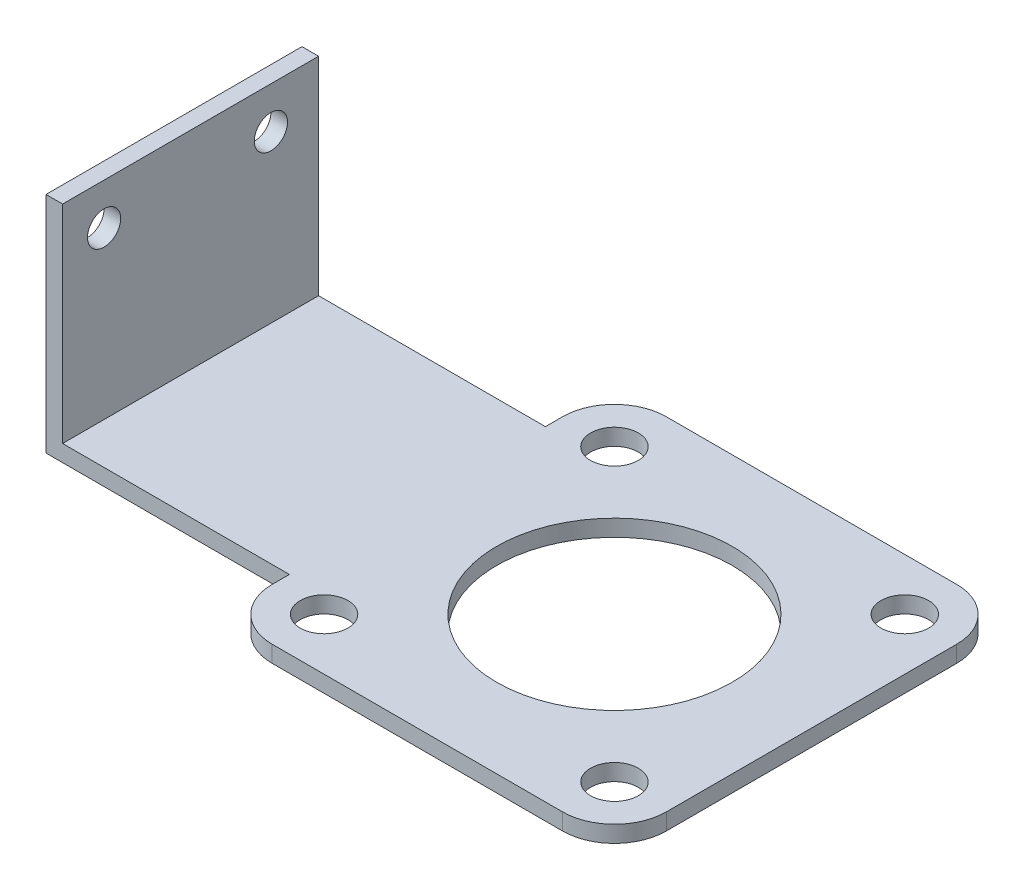
ISO-10303-21;
HEADER;
FILE_DESCRIPTION(('STEP AP214'),'2;1');
FILE_NAME('part.step','',(''),(''),'','','');
FILE_SCHEMA(('AUTOMOTIVE_DESIGN { 1 0 10303 214 1 1 1 1 }'));
ENDSEC;
DATA;
#1=APPLICATION_CONTEXT('core data for automotive mechanical design processes');
#2=APPLICATION_PROTOCOL_DEFINITION('international standard','automotive_design',2000,#1);
#3=PRODUCT_CONTEXT('',#1,'mechanical');
#4=PRODUCT('Part','Part','',(#3));
#5=PRODUCT_RELATED_PRODUCT_CATEGORY('part','',(#4));
#6=PRODUCT_DEFINITION_FORMATION('','',#4);
#7=PRODUCT_DEFINITION_CONTEXT('part definition',#1,'design');
#8=PRODUCT_DEFINITION('design','',#6,#7);
#9=PRODUCT_DEFINITION_SHAPE('','',#8);
#10=(LENGTH_UNIT() NAMED_UNIT(*) SI_UNIT(.MILLI.,.METRE.));
#11=(NAMED_UNIT(*) PLANE_ANGLE_UNIT() SI_UNIT($,.RADIAN.));
#12=(NAMED_UNIT(*) SI_UNIT($,.STERADIAN.) SOLID_ANGLE_UNIT());
#13=UNCERTAINTY_MEASURE_WITH_UNIT(LENGTH_MEASURE(1.E-05),#10,'distance_accuracy_value','');
#14=(GEOMETRIC_REPRESENTATION_CONTEXT(3) GLOBAL_UNCERTAINTY_ASSIGNED_CONTEXT((#13)) GLOBAL_UNIT_ASSIGNED_CONTEXT((#10,
#11,#12)) REPRESENTATION_CONTEXT('',''));
#15=CARTESIAN_POINT('',(0.,0.,0.));
#16=DIRECTION('',(0.,0.,1.));
#17=DIRECTION('',(1.,0.,0.));
#18=AXIS2_PLACEMENT_3D('',#15,#16,#17);
#19=CARTESIAN_POINT('',(82.5,4.,-82.5));
#20=DIRECTION('',(0.,-1.,0.));
#21=DIRECTION('',(0.,0.,-1.));
#22=AXIS2_PLACEMENT_3D('',#19,#20,#21);
#23=PLANE('',#22);
#24=CARTESIAN_POINT('',(47.5,4.,-47.5));
#25=DIRECTION('',(0.,1.,0.));
#26=DIRECTION('',(0.,0.,1.));
#27=AXIS2_PLACEMENT_3D('',#24,#25,#26);
#28=CIRCLE('',#27,28.395);
#29=CARTESIAN_POINT('',(47.5,4.,-19.105));
#30=VERTEX_POINT('',#29);
#31=EDGE_CURVE('E624',#30,#30,#28,.T.);
#32=ORIENTED_EDGE('',*,*,#31,.F.);
#33=EDGE_LOOP('',(#32));
#34=FACE_BOUND('',#33,.T.);
#35=CARTESIAN_POINT('',(12.5000000000001,4.,-82.5));
#36=DIRECTION('',(0.,-1.,0.));
#37=DIRECTION('',(0.,0.,-1.));
#38=AXIS2_PLACEMENT_3D('',#35,#36,#37);
#39=CIRCLE('',#38,5.75000000000001);
#40=CARTESIAN_POINT('',(12.5000000000001,4.,-88.25));
#41=VERTEX_POINT('',#40);
#42=EDGE_CURVE('E220',#41,#41,#39,.F.);
#43=ORIENTED_EDGE('',*,*,#42,.F.);
#44=EDGE_LOOP('',(#43));
#45=FACE_BOUND('',#44,.T.);
#46=CARTESIAN_POINT('',(82.5,4.,-12.5000000000001));
#47=DIRECTION('',(0.,-1.,0.));
#48=DIRECTION('',(0.,0.,-1.));
#49=AXIS2_PLACEMENT_3D('',#46,#47,#48);
#50=CIRCLE('',#49,5.75);
#51=CARTESIAN_POINT('',(82.5,4.,-18.2500000000001));
#52=VERTEX_POINT('',#51);
#53=EDGE_CURVE('E225',#52,#52,#50,.F.);
#54=ORIENTED_EDGE('',*,*,#53,.F.);
#55=EDGE_LOOP('',(#54));
#56=FACE_BOUND('',#55,.T.);
#57=CARTESIAN_POINT('',(12.5,4.,-12.5));
#58=DIRECTION('',(0.,-1.,0.));
#59=DIRECTION('',(0.,0.,-1.));
#60=AXIS2_PLACEMENT_3D('',#57,#58,#59);
#61=CIRCLE('',#60,5.75);
#62=CARTESIAN_POINT('',(12.5,4.,-18.25));
#63=VERTEX_POINT('',#62);
#64=EDGE_CURVE('E230',#63,#63,#61,.F.);
#65=ORIENTED_EDGE('',*,*,#64,.F.);
#66=EDGE_LOOP('',(#65));
#67=FACE_BOUND('',#66,.T.);
#68=CARTESIAN_POINT('',(82.5,4.,-82.5));
#69=DIRECTION('',(0.,-1.,0.));
#70=DIRECTION('',(0.,0.,-1.));
#71=AXIS2_PLACEMENT_3D('',#68,#69,#70);
#72=CIRCLE('',#71,5.75000000000003);
#73=CARTESIAN_POINT('',(82.5,4.,-88.25));
#74=VERTEX_POINT('',#73);
#75=EDGE_CURVE('E235',#74,#74,#72,.F.);
#76=ORIENTED_EDGE('',*,*,#75,.F.);
#77=EDGE_LOOP('',(#76));
#78=FACE_BOUND('',#77,.T.);
#79=DIRECTION('',(0.,0.,-1.));
#80=VECTOR('',#79,1.);
#81=CARTESIAN_POINT('',(-54.68,4.,-78.3587415155287));
#82=LINE('',#81,#80);
#83=CARTESIAN_POINT('',(-54.68,4.00000000000001,-16.6412584844545));
#84=VERTEX_POINT('',#83);
#85=CARTESIAN_POINT('',(-54.68,4.,-78.3587415155287));
#86=VERTEX_POINT('',#85);
#87=EDGE_CURVE('E65',#84,#86,#82,.T.);
#88=ORIENTED_EDGE('',*,*,#87,.F.);
#89=DIRECTION('',(1.,0.,0.));
#90=VECTOR('',#89,1.);
#91=CARTESIAN_POINT('',(-58.68,4.00000000000001,-16.6412584844545));
#92=LINE('',#91,#90);
#93=CARTESIAN_POINT('',(0.,4.,-16.6412584844545));
#94=VERTEX_POINT('',#93);
#95=EDGE_CURVE('E69',#84,#94,#92,.T.);
#96=ORIENTED_EDGE('',*,*,#95,.T.);
#97=DIRECTION('',(0.,0.,1.));
#98=VECTOR('',#97,1.);
#99=CARTESIAN_POINT('',(0.,4.,-12.5000000000001));
#100=LINE('',#99,#98);
#101=CARTESIAN_POINT('',(0.,4.,-12.5000000000001));
#102=VERTEX_POINT('',#101);
#103=EDGE_CURVE('E251',#94,#102,#100,.T.);
#104=ORIENTED_EDGE('',*,*,#103,.T.);
#105=CARTESIAN_POINT('',(12.5,4.,-12.5));
#106=DIRECTION('',(0.,1.,0.));
#107=DIRECTION('',(0.,0.,-1.));
#108=AXIS2_PLACEMENT_3D('',#105,#106,#107);
#109=CIRCLE('',#108,12.5);
#110=CARTESIAN_POINT('',(12.5000000000001,4.,0.));
#111=VERTEX_POINT('',#110);
#112=EDGE_CURVE('E256',#102,#111,#109,.T.);
#113=ORIENTED_EDGE('',*,*,#112,.T.);
#114=DIRECTION('',(1.,0.,0.));
#115=VECTOR('',#114,1.);
#116=CARTESIAN_POINT('',(12.5000000000001,4.,0.));
#117=LINE('',#116,#115);
#118=CARTESIAN_POINT('',(82.4999999999999,4.,0.));
#119=VERTEX_POINT('',#118);
#120=EDGE_CURVE('E259',#111,#119,#117,.T.);
#121=ORIENTED_EDGE('',*,*,#120,.T.);
#122=CARTESIAN_POINT('',(82.5,4.,-12.5));
#123=DIRECTION('',(0.,1.,0.));
#124=DIRECTION('',(0.,0.,-1.));
#125=AXIS2_PLACEMENT_3D('',#122,#123,#124);
#126=CIRCLE('',#125,12.5);
#127=CARTESIAN_POINT('',(95.,4.,-12.5000000000001));
#128=VERTEX_POINT('',#127);
#129=EDGE_CURVE('E262',#119,#128,#126,.T.);
#130=ORIENTED_EDGE('',*,*,#129,.T.);
#131=DIRECTION('',(0.,0.,-1.));
#132=VECTOR('',#131,1.);
#133=CARTESIAN_POINT('',(95.,4.,-82.4999999999999));
#134=LINE('',#133,#132);
#135=CARTESIAN_POINT('',(95.,4.,-82.4999999999999));
#136=VERTEX_POINT('',#135);
#137=EDGE_CURVE('E265',#128,#136,#134,.T.);
#138=ORIENTED_EDGE('',*,*,#137,.T.);
#139=CARTESIAN_POINT('',(82.5,4.,-82.5));
#140=DIRECTION('',(0.,1.,0.));
#141=DIRECTION('',(0.,0.,-1.));
#142=AXIS2_PLACEMENT_3D('',#139,#140,#141);
#143=CIRCLE('',#142,12.5);
#144=CARTESIAN_POINT('',(82.4999999999999,4.,-95.));
#145=VERTEX_POINT('',#144);
#146=EDGE_CURVE('E240',#136,#145,#143,.T.);
#147=ORIENTED_EDGE('',*,*,#146,.T.);
#148=DIRECTION('',(-1.,0.,0.));
#149=VECTOR('',#148,1.);
#150=CARTESIAN_POINT('',(12.5000000000001,4.,-95.));
#151=LINE('',#150,#149);
#152=CARTESIAN_POINT('',(12.5000000000001,4.,-95.));
#153=VERTEX_POINT('',#152);
#154=EDGE_CURVE('E244',#145,#153,#151,.T.);
#155=ORIENTED_EDGE('',*,*,#154,.T.);
#156=CARTESIAN_POINT('',(12.5,4.,-82.5));
#157=DIRECTION('',(0.,1.,0.));
#158=DIRECTION('',(0.,0.,1.));
#159=AXIS2_PLACEMENT_3D('',#156,#157,#158);
#160=CIRCLE('',#159,12.5);
#161=CARTESIAN_POINT('',(0.,4.,-82.4999999999999));
#162=VERTEX_POINT('',#161);
#163=EDGE_CURVE('E248',#153,#162,#160,.T.);
#164=ORIENTED_EDGE('',*,*,#163,.T.);
#165=CARTESIAN_POINT('',(0.,4.,-78.3587415155287));
#166=VERTEX_POINT('',#165);
#167=EDGE_CURVE('E252',#162,#166,#100,.T.);
#168=ORIENTED_EDGE('',*,*,#167,.T.);
#169=DIRECTION('',(1.,0.,0.));
#170=VECTOR('',#169,1.);
#171=CARTESIAN_POINT('',(-58.68,4.,-78.3587415155287));
#172=LINE('',#171,#170);
#173=EDGE_CURVE('E214',#86,#166,#172,.T.);
#174=ORIENTED_EDGE('',*,*,#173,.F.);
#175=EDGE_LOOP('',(#88,#96,#104,#113,#121,#130,#138,#147,#155,#164,#168,#174));
#176=FACE_BOUND('',#175,.T.);
#177=ADVANCED_FACE('F47',(#34,#45,#56,#67,#78,#176),#23,.F.);
#178=CARTESIAN_POINT('',(0.,4.,-12.5000000000001));
#179=DIRECTION('',(1.,0.,0.));
#180=DIRECTION('',(0.,0.,-1.));
#181=AXIS2_PLACEMENT_3D('',#178,#179,#180);
#182=PLANE('',#181);
#183=DIRECTION('',(0.,1.,0.));
#184=VECTOR('',#183,1.);
#185=CARTESIAN_POINT('',(0.,0.,-16.6412584844545));
#186=LINE('',#185,#184);
#187=CARTESIAN_POINT('',(0.,0.,-16.6412584844545));
#188=VERTEX_POINT('',#187);
#189=EDGE_CURVE('E196',#188,#94,#186,.T.);
#190=ORIENTED_EDGE('',*,*,#189,.F.);
#191=DIRECTION('',(0.,0.,1.));
#192=VECTOR('',#191,1.);
#193=CARTESIAN_POINT('',(0.,0.,-12.5000000000001));
#194=LINE('',#193,#192);
#195=CARTESIAN_POINT('',(0.,0.,-12.5000000000001));
#196=VERTEX_POINT('',#195);
#197=EDGE_CURVE('E278',#188,#196,#194,.T.);
#198=ORIENTED_EDGE('',*,*,#197,.T.);
#199=DIRECTION('',(0.,-1.,0.));
#200=VECTOR('',#199,1.);
#201=CARTESIAN_POINT('',(0.,4.,-12.5000000000001));
#202=LINE('',#201,#200);
#203=EDGE_CURVE('E308',#102,#196,#202,.T.);
#204=ORIENTED_EDGE('',*,*,#203,.F.);
#205=ORIENTED_EDGE('',*,*,#103,.F.);
#206=EDGE_LOOP('',(#190,#198,#204,#205));
#207=FACE_BOUND('',#206,.T.);
#208=ADVANCED_FACE('F358',(#207),#182,.F.);
#209=DIRECTION('',(0.,-1.,0.));
#210=VECTOR('',#209,1.);
#211=CARTESIAN_POINT('',(0.,4.,-78.3587415155287));
#212=LINE('',#211,#210);
#213=CARTESIAN_POINT('',(0.,0.,-78.3587415155287));
#214=VERTEX_POINT('',#213);
#215=EDGE_CURVE('E161',#166,#214,#212,.T.);
#216=ORIENTED_EDGE('',*,*,#215,.F.);
#217=ORIENTED_EDGE('',*,*,#167,.F.);
#218=DIRECTION('',(0.,-1.,0.));
#219=VECTOR('',#218,1.);
#220=CARTESIAN_POINT('',(0.,4.,-82.4999999999999));
#221=LINE('',#220,#219);
#222=CARTESIAN_POINT('',(0.,0.,-82.4999999999999));
#223=VERTEX_POINT('',#222);
#224=EDGE_CURVE('E312',#162,#223,#221,.T.);
#225=ORIENTED_EDGE('',*,*,#224,.T.);
#226=EDGE_CURVE('E279',#223,#214,#194,.T.);
#227=ORIENTED_EDGE('',*,*,#226,.T.);
#228=EDGE_LOOP('',(#216,#217,#225,#227));
#229=FACE_BOUND('',#228,.T.);
#230=ADVANCED_FACE('F365',(#229),#182,.F.);
#231=CARTESIAN_POINT('',(82.5,4.,-82.5));
#232=DIRECTION('',(0.,-1.,0.));
#233=DIRECTION('',(0.,0.,-1.));
#234=AXIS2_PLACEMENT_3D('',#231,#232,#233);
#235=CYLINDRICAL_SURFACE('',#234,12.5);
#236=CARTESIAN_POINT('',(82.5,0.,-82.5));
#237=DIRECTION('',(0.,1.,0.));
#238=DIRECTION('',(0.,0.,-1.));
#239=AXIS2_PLACEMENT_3D('',#236,#237,#238);
#240=CIRCLE('',#239,12.5);
#241=CARTESIAN_POINT('',(95.,0.,-82.4999999999999));
#242=VERTEX_POINT('',#241);
#243=CARTESIAN_POINT('',(82.4999999999999,0.,-95.));
#244=VERTEX_POINT('',#243);
#245=EDGE_CURVE('E239',#242,#244,#240,.T.);
#246=ORIENTED_EDGE('',*,*,#245,.T.);
#247=DIRECTION('',(0.,-1.,0.));
#248=VECTOR('',#247,1.);
#249=CARTESIAN_POINT('',(82.4999999999999,4.,-95.));
#250=LINE('',#249,#248);
#251=EDGE_CURVE('E11',#145,#244,#250,.T.);
#252=ORIENTED_EDGE('',*,*,#251,.F.);
#253=ORIENTED_EDGE('',*,*,#146,.F.);
#254=DIRECTION('',(0.,-1.,0.));
#255=VECTOR('',#254,1.);
#256=CARTESIAN_POINT('',(95.,4.,-82.4999999999999));
#257=LINE('',#256,#255);
#258=EDGE_CURVE('E268',#136,#242,#257,.T.);
#259=ORIENTED_EDGE('',*,*,#258,.T.);
#260=EDGE_LOOP('',(#246,#252,#253,#259));
#261=FACE_BOUND('',#260,.T.);
#262=ADVANCED_FACE('F49',(#261),#235,.T.);
#263=CARTESIAN_POINT('',(12.5000000000001,4.,-95.));
#264=DIRECTION('',(0.,0.,1.));
#265=DIRECTION('',(1.,0.,0.));
#266=AXIS2_PLACEMENT_3D('',#263,#264,#265);
#267=PLANE('',#266);
#268=DIRECTION('',(-1.,0.,0.));
#269=VECTOR('',#268,1.);
#270=CARTESIAN_POINT('',(12.5000000000001,0.,-95.));
#271=LINE('',#270,#269);
#272=CARTESIAN_POINT('',(12.5000000000001,0.,-95.));
#273=VERTEX_POINT('',#272);
#274=EDGE_CURVE('E272',#244,#273,#271,.T.);
#275=ORIENTED_EDGE('',*,*,#274,.T.);
#276=DIRECTION('',(0.,-1.,0.));
#277=VECTOR('',#276,1.);
#278=CARTESIAN_POINT('',(12.5000000000001,4.,-95.));
#279=LINE('',#278,#277);
#280=EDGE_CURVE('E57',#153,#273,#279,.T.);
#281=ORIENTED_EDGE('',*,*,#280,.F.);
#282=ORIENTED_EDGE('',*,*,#154,.F.);
#283=ORIENTED_EDGE('',*,*,#251,.T.);
#284=EDGE_LOOP('',(#275,#281,#282,#283));
#285=FACE_BOUND('',#284,.T.);
#286=ADVANCED_FACE('F395',(#285),#267,.F.);
#287=CARTESIAN_POINT('',(12.5,4.,-82.5));
#288=DIRECTION('',(0.,-1.,0.));
#289=DIRECTION('',(0.,0.,-1.));
#290=AXIS2_PLACEMENT_3D('',#287,#288,#289);
#291=CYLINDRICAL_SURFACE('',#290,12.5);
#292=CARTESIAN_POINT('',(12.5,0.,-82.5));
#293=DIRECTION('',(0.,1.,0.));
#294=DIRECTION('',(0.,0.,1.));
#295=AXIS2_PLACEMENT_3D('',#292,#293,#294);
#296=CIRCLE('',#295,12.5);
#297=EDGE_CURVE('E275',#273,#223,#296,.T.);
#298=ORIENTED_EDGE('',*,*,#297,.T.);
#299=ORIENTED_EDGE('',*,*,#224,.F.);
#300=ORIENTED_EDGE('',*,*,#163,.F.);
#301=ORIENTED_EDGE('',*,*,#280,.T.);
#302=EDGE_LOOP('',(#298,#299,#300,#301));
#303=FACE_BOUND('',#302,.T.);
#304=ADVANCED_FACE('F391',(#303),#291,.T.);
#305=CARTESIAN_POINT('',(12.5,4.,-12.5));
#306=DIRECTION('',(0.,-1.,0.));
#307=DIRECTION('',(0.,0.,-1.));
#308=AXIS2_PLACEMENT_3D('',#305,#306,#307);
#309=CYLINDRICAL_SURFACE('',#308,12.5);
#310=CARTESIAN_POINT('',(12.5,0.,-12.5));
#311=DIRECTION('',(0.,1.,0.));
#312=DIRECTION('',(0.,0.,-1.));
#313=AXIS2_PLACEMENT_3D('',#310,#311,#312);
#314=CIRCLE('',#313,12.5);
#315=CARTESIAN_POINT('',(12.5000000000001,0.,0.));
#316=VERTEX_POINT('',#315);
#317=EDGE_CURVE('E282',#196,#316,#314,.T.);
#318=ORIENTED_EDGE('',*,*,#317,.T.);
#319=DIRECTION('',(0.,-1.,0.));
#320=VECTOR('',#319,1.);
#321=CARTESIAN_POINT('',(12.5000000000001,4.,0.));
#322=LINE('',#321,#320);
#323=EDGE_CURVE('E304',#111,#316,#322,.T.);
#324=ORIENTED_EDGE('',*,*,#323,.F.);
#325=ORIENTED_EDGE('',*,*,#112,.F.);
#326=ORIENTED_EDGE('',*,*,#203,.T.);
#327=EDGE_LOOP('',(#318,#324,#325,#326));
#328=FACE_BOUND('',#327,.T.);
#329=ADVANCED_FACE('F388',(#328),#309,.T.);
#330=CARTESIAN_POINT('',(12.5000000000001,4.,0.));
#331=DIRECTION('',(0.,0.,-1.));
#332=DIRECTION('',(-1.,0.,0.));
#333=AXIS2_PLACEMENT_3D('',#330,#331,#332);
#334=PLANE('',#333);
#335=DIRECTION('',(1.,0.,0.));
#336=VECTOR('',#335,1.);
#337=CARTESIAN_POINT('',(12.5000000000001,0.,0.));
#338=LINE('',#337,#336);
#339=CARTESIAN_POINT('',(82.4999999999999,0.,0.));
#340=VERTEX_POINT('',#339);
#341=EDGE_CURVE('E285',#316,#340,#338,.T.);
#342=ORIENTED_EDGE('',*,*,#341,.T.);
#343=DIRECTION('',(0.,-1.,0.));
#344=VECTOR('',#343,1.);
#345=CARTESIAN_POINT('',(82.4999999999999,4.,0.));
#346=LINE('',#345,#344);
#347=EDGE_CURVE('E300',#119,#340,#346,.T.);
#348=ORIENTED_EDGE('',*,*,#347,.F.);
#349=ORIENTED_EDGE('',*,*,#120,.F.);
#350=ORIENTED_EDGE('',*,*,#323,.T.);
#351=EDGE_LOOP('',(#342,#348,#349,#350));
#352=FACE_BOUND('',#351,.T.);
#353=ADVANCED_FACE('F384',(#352),#334,.F.);
#354=CARTESIAN_POINT('',(82.5,4.,-12.5));
#355=DIRECTION('',(0.,-1.,0.));
#356=DIRECTION('',(0.,0.,-1.));
#357=AXIS2_PLACEMENT_3D('',#354,#355,#356);
#358=CYLINDRICAL_SURFACE('',#357,12.5);
#359=CARTESIAN_POINT('',(82.5,0.,-12.5));
#360=DIRECTION('',(0.,1.,0.));
#361=DIRECTION('',(0.,0.,-1.));
#362=AXIS2_PLACEMENT_3D('',#359,#360,#361);
#363=CIRCLE('',#362,12.5);
#364=CARTESIAN_POINT('',(95.,0.,-12.5000000000001));
#365=VERTEX_POINT('',#364);
#366=EDGE_CURVE('E288',#340,#365,#363,.T.);
#367=ORIENTED_EDGE('',*,*,#366,.T.);
#368=DIRECTION('',(0.,-1.,0.));
#369=VECTOR('',#368,1.);
#370=CARTESIAN_POINT('',(95.,4.,-12.5000000000001));
#371=LINE('',#370,#369);
#372=EDGE_CURVE('E296',#128,#365,#371,.T.);
#373=ORIENTED_EDGE('',*,*,#372,.F.);
#374=ORIENTED_EDGE('',*,*,#129,.F.);
#375=ORIENTED_EDGE('',*,*,#347,.T.);
#376=EDGE_LOOP('',(#367,#373,#374,#375));
#377=FACE_BOUND('',#376,.T.);
#378=ADVANCED_FACE('F380',(#377),#358,.T.);
#379=CARTESIAN_POINT('',(95.,4.,-82.4999999999999));
#380=DIRECTION('',(-1.,0.,0.));
#381=DIRECTION('',(0.,0.,1.));
#382=AXIS2_PLACEMENT_3D('',#379,#380,#381);
#383=PLANE('',#382);
#384=DIRECTION('',(0.,0.,-1.));
#385=VECTOR('',#384,1.);
#386=CARTESIAN_POINT('',(95.,0.,-82.4999999999999));
#387=LINE('',#386,#385);
#388=EDGE_CURVE('E245',#365,#242,#387,.T.);
#389=ORIENTED_EDGE('',*,*,#388,.T.);
#390=ORIENTED_EDGE('',*,*,#258,.F.);
#391=ORIENTED_EDGE('',*,*,#137,.F.);
#392=ORIENTED_EDGE('',*,*,#372,.T.);
#393=EDGE_LOOP('',(#389,#390,#391,#392));
#394=FACE_BOUND('',#393,.T.);
#395=ADVANCED_FACE('F376',(#394),#383,.F.);
#396=CARTESIAN_POINT('',(82.5,0.,-82.5));
#397=DIRECTION('',(0.,-1.,0.));
#398=DIRECTION('',(0.,0.,-1.));
#399=AXIS2_PLACEMENT_3D('',#396,#397,#398);
#400=PLANE('',#399);
#401=CARTESIAN_POINT('',(47.5,0.,-47.5));
#402=DIRECTION('',(0.,-1.,0.));
#403=DIRECTION('',(0.,0.,-1.));
#404=AXIS2_PLACEMENT_3D('',#401,#402,#403);
#405=CIRCLE('',#404,28.395);
#406=CARTESIAN_POINT('',(47.5,0.,-75.895));
#407=VERTEX_POINT('',#406);
#408=EDGE_CURVE('E51',#407,#407,#405,.T.);
#409=ORIENTED_EDGE('',*,*,#408,.F.);
#410=EDGE_LOOP('',(#409));
#411=FACE_BOUND('',#410,.T.);
#412=CARTESIAN_POINT('',(82.5,0.,-82.5));
#413=DIRECTION('',(0.,-1.,0.));
#414=DIRECTION('',(0.,0.,-1.));
#415=AXIS2_PLACEMENT_3D('',#412,#413,#414);
#416=CIRCLE('',#415,5.75000000000003);
#417=CARTESIAN_POINT('',(82.5,0.,-88.25));
#418=VERTEX_POINT('',#417);
#419=EDGE_CURVE('E234',#418,#418,#416,.F.);
#420=ORIENTED_EDGE('',*,*,#419,.T.);
#421=EDGE_LOOP('',(#420));
#422=FACE_BOUND('',#421,.T.);
#423=CARTESIAN_POINT('',(12.5,0.,-12.5));
#424=DIRECTION('',(0.,-1.,0.));
#425=DIRECTION('',(0.,0.,-1.));
#426=AXIS2_PLACEMENT_3D('',#423,#424,#425);
#427=CIRCLE('',#426,5.75);
#428=CARTESIAN_POINT('',(12.5,0.,-18.25));
#429=VERTEX_POINT('',#428);
#430=EDGE_CURVE('E229',#429,#429,#427,.F.);
#431=ORIENTED_EDGE('',*,*,#430,.T.);
#432=EDGE_LOOP('',(#431));
#433=FACE_BOUND('',#432,.T.);
#434=CARTESIAN_POINT('',(82.5,0.,-12.5000000000001));
#435=DIRECTION('',(0.,-1.,0.));
#436=DIRECTION('',(0.,0.,-1.));
#437=AXIS2_PLACEMENT_3D('',#434,#435,#436);
#438=CIRCLE('',#437,5.75);
#439=CARTESIAN_POINT('',(82.5,0.,-18.2500000000001));
#440=VERTEX_POINT('',#439);
#441=EDGE_CURVE('E224',#440,#440,#438,.F.);
#442=ORIENTED_EDGE('',*,*,#441,.T.);
#443=EDGE_LOOP('',(#442));
#444=FACE_BOUND('',#443,.T.);
#445=CARTESIAN_POINT('',(12.5000000000001,0.,-82.5));
#446=DIRECTION('',(0.,-1.,0.));
#447=DIRECTION('',(0.,0.,-1.));
#448=AXIS2_PLACEMENT_3D('',#445,#446,#447);
#449=CIRCLE('',#448,5.75000000000001);
#450=CARTESIAN_POINT('',(12.5000000000001,0.,-88.25));
#451=VERTEX_POINT('',#450);
#452=EDGE_CURVE('E219',#451,#451,#449,.F.);
#453=ORIENTED_EDGE('',*,*,#452,.T.);
#454=EDGE_LOOP('',(#453));
#455=FACE_BOUND('',#454,.T.);
#456=ORIENTED_EDGE('',*,*,#245,.F.);
#457=ORIENTED_EDGE('',*,*,#388,.F.);
#458=ORIENTED_EDGE('',*,*,#366,.F.);
#459=ORIENTED_EDGE('',*,*,#341,.F.);
#460=ORIENTED_EDGE('',*,*,#317,.F.);
#461=ORIENTED_EDGE('',*,*,#197,.F.);
#462=DIRECTION('',(1.,0.,0.));
#463=VECTOR('',#462,1.);
#464=CARTESIAN_POINT('',(-58.68,0.,-16.6412584844545));
#465=LINE('',#464,#463);
#466=CARTESIAN_POINT('',(-58.68,0.,-16.6412584844545));
#467=VERTEX_POINT('',#466);
#468=EDGE_CURVE('E202',#467,#188,#465,.T.);
#469=ORIENTED_EDGE('',*,*,#468,.F.);
#470=DIRECTION('',(0.,0.,1.));
#471=VECTOR('',#470,1.);
#472=CARTESIAN_POINT('',(-58.68,0.,-78.3587415155287));
#473=LINE('',#472,#471);
#474=CARTESIAN_POINT('',(-58.68,0.,-78.3587415155287));
#475=VERTEX_POINT('',#474);
#476=EDGE_CURVE('E155',#475,#467,#473,.T.);
#477=ORIENTED_EDGE('',*,*,#476,.F.);
#478=DIRECTION('',(1.,0.,0.));
#479=VECTOR('',#478,1.);
#480=CARTESIAN_POINT('',(-58.68,0.,-78.3587415155287));
#481=LINE('',#480,#479);
#482=EDGE_CURVE('E210',#475,#214,#481,.T.);
#483=ORIENTED_EDGE('',*,*,#482,.T.);
#484=ORIENTED_EDGE('',*,*,#226,.F.);
#485=ORIENTED_EDGE('',*,*,#297,.F.);
#486=ORIENTED_EDGE('',*,*,#274,.F.);
#487=EDGE_LOOP('',(#456,#457,#458,#459,#460,#461,#469,#477,#483,#484,#485,#486));
#488=FACE_BOUND('',#487,.T.);
#489=ADVANCED_FACE('F374',(#411,#422,#433,#444,#455,#488),#400,.T.);
#490=CARTESIAN_POINT('',(12.5000000000001,14.,-82.5));
#491=DIRECTION('',(0.,-1.,0.));
#492=DIRECTION('',(0.,0.,-1.));
#493=AXIS2_PLACEMENT_3D('',#490,#491,#492);
#494=CYLINDRICAL_SURFACE('',#493,5.75000000000001);
#495=ORIENTED_EDGE('',*,*,#452,.F.);
#496=EDGE_LOOP('',(#495));
#497=FACE_BOUND('',#496,.T.);
#498=ORIENTED_EDGE('',*,*,#42,.T.);
#499=EDGE_LOOP('',(#498));
#500=FACE_BOUND('',#499,.T.);
#501=ADVANCED_FACE('F372',(#497,#500),#494,.F.);
#502=CARTESIAN_POINT('',(82.5,14.,-12.5000000000001));
#503=DIRECTION('',(0.,-1.,0.));
#504=DIRECTION('',(0.,0.,-1.));
#505=AXIS2_PLACEMENT_3D('',#502,#503,#504);
#506=CYLINDRICAL_SURFACE('',#505,5.75);
#507=ORIENTED_EDGE('',*,*,#441,.F.);
#508=EDGE_LOOP('',(#507));
#509=FACE_BOUND('',#508,.T.);
#510=ORIENTED_EDGE('',*,*,#53,.T.);
#511=EDGE_LOOP('',(#510));
#512=FACE_BOUND('',#511,.T.);
#513=ADVANCED_FACE('F434',(#509,#512),#506,.F.);
#514=CARTESIAN_POINT('',(12.5,14.,-12.5));
#515=DIRECTION('',(0.,-1.,0.));
#516=DIRECTION('',(0.,0.,-1.));
#517=AXIS2_PLACEMENT_3D('',#514,#515,#516);
#518=CYLINDRICAL_SURFACE('',#517,5.75);
#519=ORIENTED_EDGE('',*,*,#430,.F.);
#520=EDGE_LOOP('',(#519));
#521=FACE_BOUND('',#520,.T.);
#522=ORIENTED_EDGE('',*,*,#64,.T.);
#523=EDGE_LOOP('',(#522));
#524=FACE_BOUND('',#523,.T.);
#525=ADVANCED_FACE('F437',(#521,#524),#518,.F.);
#526=CARTESIAN_POINT('',(82.5,14.,-82.5));
#527=DIRECTION('',(0.,-1.,0.));
#528=DIRECTION('',(0.,0.,-1.));
#529=AXIS2_PLACEMENT_3D('',#526,#527,#528);
#530=CYLINDRICAL_SURFACE('',#529,5.75000000000003);
#531=ORIENTED_EDGE('',*,*,#419,.F.);
#532=EDGE_LOOP('',(#531));
#533=FACE_BOUND('',#532,.T.);
#534=ORIENTED_EDGE('',*,*,#75,.T.);
#535=EDGE_LOOP('',(#534));
#536=FACE_BOUND('',#535,.T.);
#537=ADVANCED_FACE('F433',(#533,#536),#530,.F.);
#538=CARTESIAN_POINT('',(-58.68,0.,-16.6412584844545));
#539=DIRECTION('',(0.,0.,-1.));
#540=DIRECTION('',(0.,1.,0.));
#541=AXIS2_PLACEMENT_3D('',#538,#539,#540);
#542=PLANE('',#541);
#543=ORIENTED_EDGE('',*,*,#189,.T.);
#544=ORIENTED_EDGE('',*,*,#95,.F.);
#545=DIRECTION('',(0.,-1.,0.));
#546=VECTOR('',#545,1.);
#547=CARTESIAN_POINT('',(-54.68,54.,-16.6412584844545));
#548=LINE('',#547,#546);
#549=CARTESIAN_POINT('',(-54.68,54.,-16.6412584844545));
#550=VERTEX_POINT('',#549);
#551=EDGE_CURVE('E168',#550,#84,#548,.T.);
#552=ORIENTED_EDGE('',*,*,#551,.F.);
#553=DIRECTION('',(1.,0.,0.));
#554=VECTOR('',#553,1.);
#555=CARTESIAN_POINT('',(-54.68,54.,-16.6412584844545));
#556=LINE('',#555,#554);
#557=CARTESIAN_POINT('',(-58.68,54.,-16.6412584844545));
#558=VERTEX_POINT('',#557);
#559=EDGE_CURVE('E164',#558,#550,#556,.T.);
#560=ORIENTED_EDGE('',*,*,#559,.F.);
#561=DIRECTION('',(0.,1.,0.));
#562=VECTOR('',#561,1.);
#563=CARTESIAN_POINT('',(-58.68,0.,-16.6412584844545));
#564=LINE('',#563,#562);
#565=EDGE_CURVE('E149',#467,#558,#564,.T.);
#566=ORIENTED_EDGE('',*,*,#565,.F.);
#567=ORIENTED_EDGE('',*,*,#468,.T.);
#568=EDGE_LOOP('',(#543,#544,#552,#560,#566,#567));
#569=FACE_BOUND('',#568,.T.);
#570=ADVANCED_FACE('F166',(#569),#542,.F.);
#571=CARTESIAN_POINT('',(-58.68,4.,-78.3587415155287));
#572=DIRECTION('',(0.,0.,1.));
#573=DIRECTION('',(1.,0.,0.));
#574=AXIS2_PLACEMENT_3D('',#571,#572,#573);
#575=PLANE('',#574);
#576=ORIENTED_EDGE('',*,*,#215,.T.);
#577=ORIENTED_EDGE('',*,*,#482,.F.);
#578=DIRECTION('',(0.,-1.,0.));
#579=VECTOR('',#578,1.);
#580=CARTESIAN_POINT('',(-58.68,4.,-78.3587415155287));
#581=LINE('',#580,#579);
#582=CARTESIAN_POINT('',(-58.68,54.,-78.3587415155287));
#583=VERTEX_POINT('',#582);
#584=EDGE_CURVE('E160',#583,#475,#581,.T.);
#585=ORIENTED_EDGE('',*,*,#584,.F.);
#586=DIRECTION('',(-1.,0.,0.));
#587=VECTOR('',#586,1.);
#588=CARTESIAN_POINT('',(-58.68,54.,-78.3587415155287));
#589=LINE('',#588,#587);
#590=CARTESIAN_POINT('',(-54.68,54.,-78.3587415155287));
#591=VERTEX_POINT('',#590);
#592=EDGE_CURVE('E177',#591,#583,#589,.T.);
#593=ORIENTED_EDGE('',*,*,#592,.F.);
#594=DIRECTION('',(0.,-1.,0.));
#595=VECTOR('',#594,1.);
#596=CARTESIAN_POINT('',(-54.68,54.,-78.3587415155287));
#597=LINE('',#596,#595);
#598=EDGE_CURVE('E190',#591,#86,#597,.T.);
#599=ORIENTED_EDGE('',*,*,#598,.T.);
#600=ORIENTED_EDGE('',*,*,#173,.T.);
#601=EDGE_LOOP('',(#576,#577,#585,#593,#599,#600));
#602=FACE_BOUND('',#601,.T.);
#603=ADVANCED_FACE('F416',(#602),#575,.F.);
#604=CARTESIAN_POINT('',(-58.68,0.,0.));
#605=DIRECTION('',(1.,0.,0.));
#606=DIRECTION('',(0.,0.,-1.));
#607=AXIS2_PLACEMENT_3D('',#604,#605,#606);
#608=PLANE('',#607);
#609=CARTESIAN_POINT('',(-58.68,44.,-66.8587415155287));
#610=DIRECTION('',(-1.,0.,0.));
#611=DIRECTION('',(0.,0.,1.));
#612=AXIS2_PLACEMENT_3D('',#609,#610,#611);
#613=CIRCLE('',#612,4.00000000000001);
#614=CARTESIAN_POINT('',(-58.68,44.,-62.8587415155287));
#615=VERTEX_POINT('',#614);
#616=EDGE_CURVE('E334',#615,#615,#613,.T.);
#617=ORIENTED_EDGE('',*,*,#616,.F.);
#618=EDGE_LOOP('',(#617));
#619=FACE_BOUND('',#618,.T.);
#620=CARTESIAN_POINT('',(-58.68,44.,-26.6412584844545));
#621=DIRECTION('',(-1.,0.,0.));
#622=DIRECTION('',(0.,0.,1.));
#623=AXIS2_PLACEMENT_3D('',#620,#621,#622);
#624=CIRCLE('',#623,4.);
#625=CARTESIAN_POINT('',(-58.68,44.,-22.6412584844545));
#626=VERTEX_POINT('',#625);
#627=EDGE_CURVE('E184',#626,#626,#624,.T.);
#628=ORIENTED_EDGE('',*,*,#627,.F.);
#629=EDGE_LOOP('',(#628));
#630=FACE_BOUND('',#629,.T.);
#631=ORIENTED_EDGE('',*,*,#565,.T.);
#632=DIRECTION('',(0.,0.,1.));
#633=VECTOR('',#632,1.);
#634=CARTESIAN_POINT('',(-58.68,54.,-16.6412584844545));
#635=LINE('',#634,#633);
#636=EDGE_CURVE('E153',#583,#558,#635,.T.);
#637=ORIENTED_EDGE('',*,*,#636,.F.);
#638=ORIENTED_EDGE('',*,*,#584,.T.);
#639=ORIENTED_EDGE('',*,*,#476,.T.);
#640=EDGE_LOOP('',(#631,#637,#638,#639));
#641=FACE_BOUND('',#640,.T.);
#642=ADVANCED_FACE('F151',(#619,#630,#641),#608,.F.);
#643=CARTESIAN_POINT('',(-54.68,54.,-78.3587415155287));
#644=DIRECTION('',(-1.,0.,0.));
#645=DIRECTION('',(0.,0.,1.));
#646=AXIS2_PLACEMENT_3D('',#643,#644,#645);
#647=PLANE('',#646);
#648=CARTESIAN_POINT('',(-54.68,44.,-66.8587415155287));
#649=DIRECTION('',(-1.,0.,0.));
#650=DIRECTION('',(0.,0.,1.));
#651=AXIS2_PLACEMENT_3D('',#648,#649,#650);
#652=CIRCLE('',#651,4.00000000000001);
#653=CARTESIAN_POINT('',(-54.68,44.,-62.8587415155287));
#654=VERTEX_POINT('',#653);
#655=EDGE_CURVE('E181',#654,#654,#652,.T.);
#656=ORIENTED_EDGE('',*,*,#655,.T.);
#657=EDGE_LOOP('',(#656));
#658=FACE_BOUND('',#657,.T.);
#659=CARTESIAN_POINT('',(-54.68,44.,-26.6412584844545));
#660=DIRECTION('',(-1.,0.,0.));
#661=DIRECTION('',(0.,0.,1.));
#662=AXIS2_PLACEMENT_3D('',#659,#660,#661);
#663=CIRCLE('',#662,4.);
#664=CARTESIAN_POINT('',(-54.68,44.,-22.6412584844545));
#665=VERTEX_POINT('',#664);
#666=EDGE_CURVE('E331',#665,#665,#663,.T.);
#667=ORIENTED_EDGE('',*,*,#666,.T.);
#668=EDGE_LOOP('',(#667));
#669=FACE_BOUND('',#668,.T.);
#670=ORIENTED_EDGE('',*,*,#87,.T.);
#671=ORIENTED_EDGE('',*,*,#598,.F.);
#672=DIRECTION('',(0.,0.,-1.));
#673=VECTOR('',#672,1.);
#674=CARTESIAN_POINT('',(-54.68,54.,-78.3587415155287));
#675=LINE('',#674,#673);
#676=EDGE_CURVE('E172',#550,#591,#675,.T.);
#677=ORIENTED_EDGE('',*,*,#676,.F.);
#678=ORIENTED_EDGE('',*,*,#551,.T.);
#679=EDGE_LOOP('',(#670,#671,#677,#678));
#680=FACE_BOUND('',#679,.T.);
#681=ADVANCED_FACE('F339',(#658,#669,#680),#647,.F.);
#682=CARTESIAN_POINT('',(0.,54.,0.));
#683=DIRECTION('',(0.,-1.,0.));
#684=DIRECTION('',(0.,0.,-1.));
#685=AXIS2_PLACEMENT_3D('',#682,#683,#684);
#686=PLANE('',#685);
#687=ORIENTED_EDGE('',*,*,#636,.T.);
#688=ORIENTED_EDGE('',*,*,#559,.T.);
#689=ORIENTED_EDGE('',*,*,#676,.T.);
#690=ORIENTED_EDGE('',*,*,#592,.T.);
#691=EDGE_LOOP('',(#687,#688,#689,#690));
#692=FACE_BOUND('',#691,.T.);
#693=ADVANCED_FACE('F175',(#692),#686,.F.);
#694=CARTESIAN_POINT('',(-38.68,44.,-26.6412584844545));
#695=DIRECTION('',(-1.,0.,0.));
#696=DIRECTION('',(0.,0.,1.));
#697=AXIS2_PLACEMENT_3D('',#694,#695,#696);
#698=CYLINDRICAL_SURFACE('',#697,4.);
#699=ORIENTED_EDGE('',*,*,#627,.T.);
#700=EDGE_LOOP('',(#699));
#701=FACE_BOUND('',#700,.T.);
#702=ORIENTED_EDGE('',*,*,#666,.F.);
#703=EDGE_LOOP('',(#702));
#704=FACE_BOUND('',#703,.T.);
#705=ADVANCED_FACE('F345',(#701,#704),#698,.F.);
#706=CARTESIAN_POINT('',(-38.68,44.,-66.8587415155287));
#707=DIRECTION('',(-1.,0.,0.));
#708=DIRECTION('',(0.,0.,1.));
#709=AXIS2_PLACEMENT_3D('',#706,#707,#708);
#710=CYLINDRICAL_SURFACE('',#709,4.00000000000001);
#711=ORIENTED_EDGE('',*,*,#616,.T.);
#712=EDGE_LOOP('',(#711));
#713=FACE_BOUND('',#712,.T.);
#714=ORIENTED_EDGE('',*,*,#655,.F.);
#715=EDGE_LOOP('',(#714));
#716=FACE_BOUND('',#715,.T.);
#717=ADVANCED_FACE('F342',(#713,#716),#710,.F.);
#718=CARTESIAN_POINT('',(47.5,-6.,-47.5));
#719=DIRECTION('',(0.,1.,0.));
#720=DIRECTION('',(0.,0.,1.));
#721=AXIS2_PLACEMENT_3D('',#718,#719,#720);
#722=CYLINDRICAL_SURFACE('',#721,28.395);
#723=ORIENTED_EDGE('',*,*,#408,.T.);
#724=EDGE_LOOP('',(#723));
#725=FACE_BOUND('',#724,.T.);
#726=ORIENTED_EDGE('',*,*,#31,.T.);
#727=EDGE_LOOP('',(#726));
#728=FACE_BOUND('',#727,.T.);
#729=ADVANCED_FACE('F344',(#725,#728),#722,.F.);
#730=CLOSED_SHELL('',(#177,#208,#230,#262,#286,#304,#329,#353,#378,#395,#489,#501,#513,#525,
#537,#570,#603,#642,#681,#693,#705,#717,#729));
#731=MANIFOLD_SOLID_BREP('B2',#730);
#732=ADVANCED_BREP_SHAPE_REPRESENTATION('',(#18,#731),#14);
#733=SHAPE_DEFINITION_REPRESENTATION(#9,#732);
ENDSEC;
END-ISO-10303-21;
